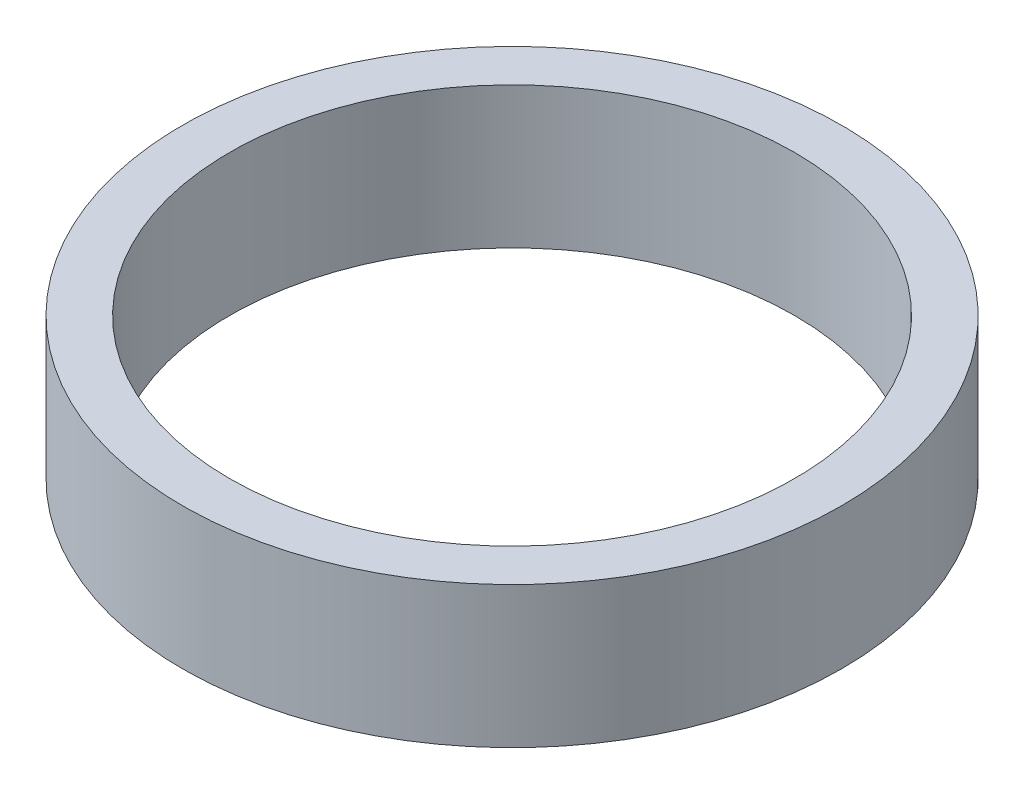
ISO-10303-21;
HEADER;
FILE_DESCRIPTION(('STEP AP214'),'2;1');
FILE_NAME('part.step','',(''),(''),'','','');
FILE_SCHEMA(('AUTOMOTIVE_DESIGN { 1 0 10303 214 1 1 1 1 }'));
ENDSEC;
DATA;
#1=APPLICATION_CONTEXT('core data for automotive mechanical design processes');
#2=APPLICATION_PROTOCOL_DEFINITION('international standard','automotive_design',2000,#1);
#3=PRODUCT_CONTEXT('',#1,'mechanical');
#4=PRODUCT('Part','Part','',(#3));
#5=PRODUCT_RELATED_PRODUCT_CATEGORY('part','',(#4));
#6=PRODUCT_DEFINITION_FORMATION('','',#4);
#7=PRODUCT_DEFINITION_CONTEXT('part definition',#1,'design');
#8=PRODUCT_DEFINITION('design','',#6,#7);
#9=PRODUCT_DEFINITION_SHAPE('','',#8);
#10=(LENGTH_UNIT() NAMED_UNIT(*) SI_UNIT(.MILLI.,.METRE.));
#11=(NAMED_UNIT(*) PLANE_ANGLE_UNIT() SI_UNIT($,.RADIAN.));
#12=(NAMED_UNIT(*) SI_UNIT($,.STERADIAN.) SOLID_ANGLE_UNIT());
#13=UNCERTAINTY_MEASURE_WITH_UNIT(LENGTH_MEASURE(1.E-05),#10,'distance_accuracy_value','');
#14=(GEOMETRIC_REPRESENTATION_CONTEXT(3) GLOBAL_UNCERTAINTY_ASSIGNED_CONTEXT((#13)) GLOBAL_UNIT_ASSIGNED_CONTEXT((#10,
#11,#12)) REPRESENTATION_CONTEXT('',''));
#15=CARTESIAN_POINT('',(0.,0.,0.));
#16=DIRECTION('',(0.,0.,1.));
#17=DIRECTION('',(1.,0.,0.));
#18=AXIS2_PLACEMENT_3D('',#15,#16,#17);
#19=CARTESIAN_POINT('',(0.,3.,0.));
#20=DIRECTION('',(0.,1.,0.));
#21=DIRECTION('',(0.,0.,1.));
#22=AXIS2_PLACEMENT_3D('',#19,#20,#21);
#23=PLANE('',#22);
#24=CARTESIAN_POINT('',(0.,3.,0.));
#25=DIRECTION('',(0.,1.,0.));
#26=DIRECTION('',(1.,0.,0.));
#27=AXIS2_PLACEMENT_3D('',#24,#25,#26);
#28=CIRCLE('',#27,7.);
#29=CARTESIAN_POINT('',(7.,3.,0.));
#30=VERTEX_POINT('',#29);
#31=EDGE_CURVE('E11',#30,#30,#28,.T.);
#32=ORIENTED_EDGE('',*,*,#31,.T.);
#33=EDGE_LOOP('',(#32));
#34=FACE_BOUND('',#33,.T.);
#35=CARTESIAN_POINT('',(0.,3.,0.));
#36=DIRECTION('',(0.,1.,0.));
#37=DIRECTION('',(0.,0.,1.));
#38=AXIS2_PLACEMENT_3D('',#35,#36,#37);
#39=CIRCLE('',#38,6.);
#40=CARTESIAN_POINT('',(0.,3.,6.));
#41=VERTEX_POINT('',#40);
#42=EDGE_CURVE('E54',#41,#41,#39,.T.);
#43=ORIENTED_EDGE('',*,*,#42,.F.);
#44=EDGE_LOOP('',(#43));
#45=FACE_BOUND('',#44,.T.);
#46=ADVANCED_FACE('F43',(#34,#45),#23,.T.);
#47=CARTESIAN_POINT('',(0.,0.,0.));
#48=DIRECTION('',(0.,1.,0.));
#49=DIRECTION('',(0.,0.,1.));
#50=AXIS2_PLACEMENT_3D('',#47,#48,#49);
#51=PLANE('',#50);
#52=CARTESIAN_POINT('',(0.,0.,0.));
#53=DIRECTION('',(0.,1.,0.));
#54=DIRECTION('',(1.,0.,0.));
#55=AXIS2_PLACEMENT_3D('',#52,#53,#54);
#56=CIRCLE('',#55,7.);
#57=CARTESIAN_POINT('',(7.,0.,0.));
#58=VERTEX_POINT('',#57);
#59=EDGE_CURVE('E47',#58,#58,#56,.T.);
#60=ORIENTED_EDGE('',*,*,#59,.F.);
#61=EDGE_LOOP('',(#60));
#62=FACE_BOUND('',#61,.T.);
#63=CARTESIAN_POINT('',(0.,0.,0.));
#64=DIRECTION('',(0.,1.,0.));
#65=DIRECTION('',(0.,0.,1.));
#66=AXIS2_PLACEMENT_3D('',#63,#64,#65);
#67=CIRCLE('',#66,6.);
#68=CARTESIAN_POINT('',(0.,0.,6.));
#69=VERTEX_POINT('',#68);
#70=EDGE_CURVE('E56',#69,#69,#67,.T.);
#71=ORIENTED_EDGE('',*,*,#70,.T.);
#72=EDGE_LOOP('',(#71));
#73=FACE_BOUND('',#72,.T.);
#74=ADVANCED_FACE('F66',(#62,#73),#51,.F.);
#75=CARTESIAN_POINT('',(0.,3.,0.));
#76=DIRECTION('',(0.,-1.,0.));
#77=DIRECTION('',(0.,0.,-1.));
#78=AXIS2_PLACEMENT_3D('',#75,#76,#77);
#79=CYLINDRICAL_SURFACE('',#78,7.);
#80=ORIENTED_EDGE('',*,*,#31,.F.);
#81=EDGE_LOOP('',(#80));
#82=FACE_BOUND('',#81,.T.);
#83=ORIENTED_EDGE('',*,*,#59,.T.);
#84=EDGE_LOOP('',(#83));
#85=FACE_BOUND('',#84,.T.);
#86=ADVANCED_FACE('F45',(#82,#85),#79,.T.);
#87=CARTESIAN_POINT('',(0.,3.,0.));
#88=DIRECTION('',(0.,-1.,0.));
#89=DIRECTION('',(0.,0.,-1.));
#90=AXIS2_PLACEMENT_3D('',#87,#88,#89);
#91=CYLINDRICAL_SURFACE('',#90,6.);
#92=ORIENTED_EDGE('',*,*,#42,.T.);
#93=EDGE_LOOP('',(#92));
#94=FACE_BOUND('',#93,.T.);
#95=ORIENTED_EDGE('',*,*,#70,.F.);
#96=EDGE_LOOP('',(#95));
#97=FACE_BOUND('',#96,.T.);
#98=ADVANCED_FACE('F62',(#94,#97),#91,.F.);
#99=CLOSED_SHELL('',(#46,#74,#86,#98));
#100=MANIFOLD_SOLID_BREP('B2',#99);
#101=ADVANCED_BREP_SHAPE_REPRESENTATION('',(#18,#100),#14);
#102=SHAPE_DEFINITION_REPRESENTATION(#9,#101);
ENDSEC;
END-ISO-10303-21;
